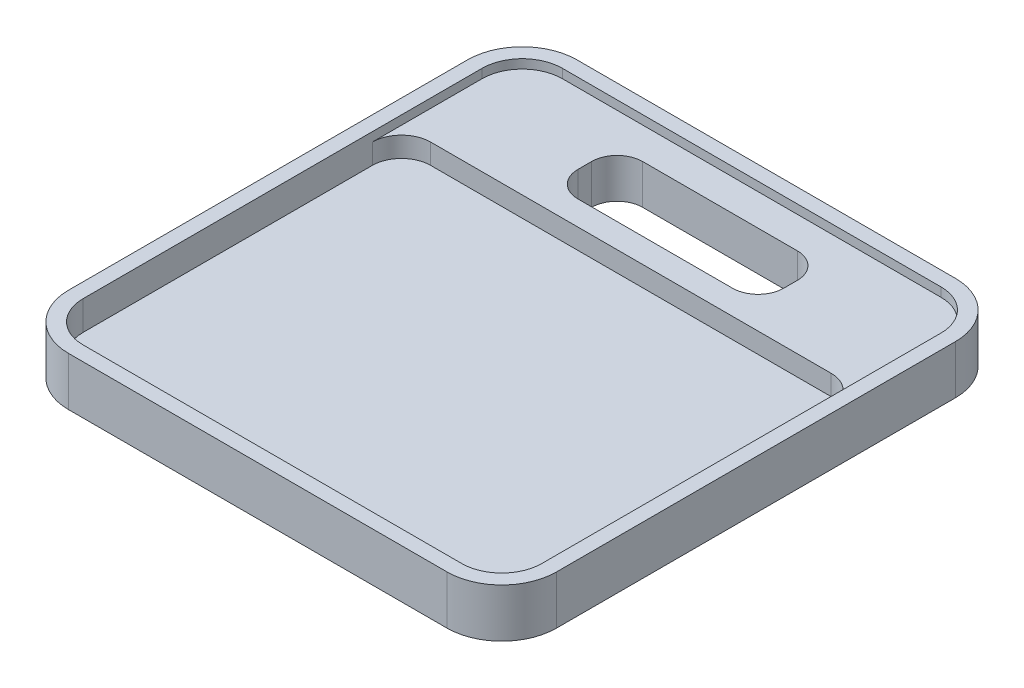
ISO-10303-21;
HEADER;
FILE_DESCRIPTION(('STEP AP214'),'2;1');
FILE_NAME('part.step','',(''),(''),'','','');
FILE_SCHEMA(('AUTOMOTIVE_DESIGN { 1 0 10303 214 1 1 1 1 }'));
ENDSEC;
DATA;
#1=APPLICATION_CONTEXT('core data for automotive mechanical design processes');
#2=APPLICATION_PROTOCOL_DEFINITION('international standard','automotive_design',2000,#1);
#3=PRODUCT_CONTEXT('',#1,'mechanical');
#4=PRODUCT('Part','Part','',(#3));
#5=PRODUCT_RELATED_PRODUCT_CATEGORY('part','',(#4));
#6=PRODUCT_DEFINITION_FORMATION('','',#4);
#7=PRODUCT_DEFINITION_CONTEXT('part definition',#1,'design');
#8=PRODUCT_DEFINITION('design','',#6,#7);
#9=PRODUCT_DEFINITION_SHAPE('','',#8);
#10=(LENGTH_UNIT() NAMED_UNIT(*) SI_UNIT(.MILLI.,.METRE.));
#11=(NAMED_UNIT(*) PLANE_ANGLE_UNIT() SI_UNIT($,.RADIAN.));
#12=(NAMED_UNIT(*) SI_UNIT($,.STERADIAN.) SOLID_ANGLE_UNIT());
#13=UNCERTAINTY_MEASURE_WITH_UNIT(LENGTH_MEASURE(1.E-05),#10,'distance_accuracy_value','');
#14=(GEOMETRIC_REPRESENTATION_CONTEXT(3) GLOBAL_UNCERTAINTY_ASSIGNED_CONTEXT((#13)) GLOBAL_UNIT_ASSIGNED_CONTEXT((#10,
#11,#12)) REPRESENTATION_CONTEXT('',''));
#15=CARTESIAN_POINT('',(0.,0.,0.));
#16=DIRECTION('',(0.,0.,1.));
#17=DIRECTION('',(1.,0.,0.));
#18=AXIS2_PLACEMENT_3D('',#15,#16,#17);
#19=CARTESIAN_POINT('',(9.41759451353933,0.8,-4.88077721223382));
#20=DIRECTION('',(0.,0.,-1.));
#21=DIRECTION('',(-1.,0.,0.));
#22=AXIS2_PLACEMENT_3D('',#19,#20,#21);
#23=PLANE('',#22);
#24=DIRECTION('',(-1.,0.,0.));
#25=VECTOR('',#24,1.);
#26=CARTESIAN_POINT('',(9.41759451353933,0.8,-4.88077721223382));
#27=LINE('',#26,#25);
#28=CARTESIAN_POINT('',(8.21759451353933,0.8,-4.88077721223382));
#29=VERTEX_POINT('',#28);
#30=CARTESIAN_POINT('',(-8.21759451353934,0.8,-4.88077721223382));
#31=VERTEX_POINT('',#30);
#32=EDGE_CURVE('E272',#29,#31,#27,.T.);
#33=ORIENTED_EDGE('',*,*,#32,.F.);
#34=DIRECTION('',(0.,1.,0.));
#35=VECTOR('',#34,1.);
#36=CARTESIAN_POINT('',(8.21759451353933,1.63,-4.88077721223382));
#37=LINE('',#36,#35);
#38=CARTESIAN_POINT('',(8.21759451353933,1.63,-4.88077721223382));
#39=VERTEX_POINT('',#38);
#40=EDGE_CURVE('E426',#29,#39,#37,.T.);
#41=ORIENTED_EDGE('',*,*,#40,.T.);
#42=DIRECTION('',(-1.,0.,0.));
#43=VECTOR('',#42,1.);
#44=CARTESIAN_POINT('',(9.41759451353933,1.63,-4.88077721223382));
#45=LINE('',#44,#43);
#46=CARTESIAN_POINT('',(-8.21759451353934,1.63,-4.88077721223382));
#47=VERTEX_POINT('',#46);
#48=EDGE_CURVE('E234',#39,#47,#45,.T.);
#49=ORIENTED_EDGE('',*,*,#48,.T.);
#50=DIRECTION('',(0.,1.,0.));
#51=VECTOR('',#50,1.);
#52=CARTESIAN_POINT('',(-8.21759451353934,0.8,-4.88077721223382));
#53=LINE('',#52,#51);
#54=EDGE_CURVE('E424',#47,#31,#53,.F.);
#55=ORIENTED_EDGE('',*,*,#54,.T.);
#56=EDGE_LOOP('',(#33,#41,#49,#55));
#57=FACE_BOUND('',#56,.T.);
#58=ADVANCED_FACE('F38',(#57),#23,.F.);
#59=CARTESIAN_POINT('',(-7.77,2.,8.19));
#60=DIRECTION('',(0.,-1.,0.));
#61=DIRECTION('',(0.,0.,-1.));
#62=AXIS2_PLACEMENT_3D('',#59,#60,#61);
#63=CYLINDRICAL_SURFACE('',#62,2.24759451353934);
#64=CARTESIAN_POINT('',(-7.77,0.,8.19));
#65=DIRECTION('',(0.,1.,0.));
#66=DIRECTION('',(0.,0.,1.));
#67=AXIS2_PLACEMENT_3D('',#64,#65,#66);
#68=CIRCLE('',#67,2.24759451353934);
#69=CARTESIAN_POINT('',(-10.0175945135393,0.,8.19));
#70=VERTEX_POINT('',#69);
#71=CARTESIAN_POINT('',(-7.76999999999999,0.,10.4375945135393));
#72=VERTEX_POINT('',#71);
#73=EDGE_CURVE('E344',#70,#72,#68,.T.);
#74=ORIENTED_EDGE('',*,*,#73,.T.);
#75=DIRECTION('',(0.,-1.,0.));
#76=VECTOR('',#75,1.);
#77=CARTESIAN_POINT('',(-7.76999999999999,2.,10.4375945135393));
#78=LINE('',#77,#76);
#79=CARTESIAN_POINT('',(-7.76999999999999,2.,10.4375945135393));
#80=VERTEX_POINT('',#79);
#81=EDGE_CURVE('E421',#80,#72,#78,.T.);
#82=ORIENTED_EDGE('',*,*,#81,.F.);
#83=CARTESIAN_POINT('',(-7.77,2.,8.19));
#84=DIRECTION('',(0.,1.,0.));
#85=DIRECTION('',(0.,0.,1.));
#86=AXIS2_PLACEMENT_3D('',#83,#84,#85);
#87=CIRCLE('',#86,2.24759451353934);
#88=CARTESIAN_POINT('',(-10.0175945135393,2.,8.19));
#89=VERTEX_POINT('',#88);
#90=EDGE_CURVE('E367',#89,#80,#87,.T.);
#91=ORIENTED_EDGE('',*,*,#90,.F.);
#92=DIRECTION('',(0.,-1.,0.));
#93=VECTOR('',#92,1.);
#94=CARTESIAN_POINT('',(-10.0175945135393,2.,8.19));
#95=LINE('',#94,#93);
#96=EDGE_CURVE('E385',#89,#70,#95,.T.);
#97=ORIENTED_EDGE('',*,*,#96,.T.);
#98=EDGE_LOOP('',(#74,#82,#91,#97));
#99=FACE_BOUND('',#98,.T.);
#100=ADVANCED_FACE('F477',(#99),#63,.T.);
#101=CARTESIAN_POINT('',(-7.76999999999999,2.,10.4375945135393));
#102=DIRECTION('',(0.,0.,-1.));
#103=DIRECTION('',(-1.,0.,0.));
#104=AXIS2_PLACEMENT_3D('',#101,#102,#103);
#105=PLANE('',#104);
#106=DIRECTION('',(1.,0.,0.));
#107=VECTOR('',#106,1.);
#108=CARTESIAN_POINT('',(-7.76999999999999,0.,10.4375945135393));
#109=LINE('',#108,#107);
#110=CARTESIAN_POINT('',(7.77,0.,10.4375945135393));
#111=VERTEX_POINT('',#110);
#112=EDGE_CURVE('E388',#72,#111,#109,.T.);
#113=ORIENTED_EDGE('',*,*,#112,.T.);
#114=DIRECTION('',(0.,-1.,0.));
#115=VECTOR('',#114,1.);
#116=CARTESIAN_POINT('',(7.77,2.,10.4375945135393));
#117=LINE('',#116,#115);
#118=CARTESIAN_POINT('',(7.77,2.,10.4375945135393));
#119=VERTEX_POINT('',#118);
#120=EDGE_CURVE('E418',#119,#111,#117,.T.);
#121=ORIENTED_EDGE('',*,*,#120,.F.);
#122=DIRECTION('',(1.,0.,0.));
#123=VECTOR('',#122,1.);
#124=CARTESIAN_POINT('',(-7.76999999999999,2.,10.4375945135393));
#125=LINE('',#124,#123);
#126=EDGE_CURVE('E370',#80,#119,#125,.T.);
#127=ORIENTED_EDGE('',*,*,#126,.F.);
#128=ORIENTED_EDGE('',*,*,#81,.T.);
#129=EDGE_LOOP('',(#113,#121,#127,#128));
#130=FACE_BOUND('',#129,.T.);
#131=ADVANCED_FACE('F482',(#130),#105,.F.);
#132=CARTESIAN_POINT('',(7.77,2.,8.19));
#133=DIRECTION('',(0.,-1.,0.));
#134=DIRECTION('',(0.,0.,-1.));
#135=AXIS2_PLACEMENT_3D('',#132,#133,#134);
#136=CYLINDRICAL_SURFACE('',#135,2.24759451353934);
#137=CARTESIAN_POINT('',(7.77,0.,8.19));
#138=DIRECTION('',(0.,1.,0.));
#139=DIRECTION('',(0.,0.,1.));
#140=AXIS2_PLACEMENT_3D('',#137,#138,#139);
#141=CIRCLE('',#140,2.24759451353934);
#142=CARTESIAN_POINT('',(10.0175945135393,0.,8.19));
#143=VERTEX_POINT('',#142);
#144=EDGE_CURVE('E390',#111,#143,#141,.T.);
#145=ORIENTED_EDGE('',*,*,#144,.T.);
#146=DIRECTION('',(0.,-1.,0.));
#147=VECTOR('',#146,1.);
#148=CARTESIAN_POINT('',(10.0175945135393,2.,8.19));
#149=LINE('',#148,#147);
#150=CARTESIAN_POINT('',(10.0175945135393,2.,8.19));
#151=VERTEX_POINT('',#150);
#152=EDGE_CURVE('E415',#151,#143,#149,.T.);
#153=ORIENTED_EDGE('',*,*,#152,.F.);
#154=CARTESIAN_POINT('',(7.77,2.,8.19));
#155=DIRECTION('',(0.,1.,0.));
#156=DIRECTION('',(0.,0.,1.));
#157=AXIS2_PLACEMENT_3D('',#154,#155,#156);
#158=CIRCLE('',#157,2.24759451353934);
#159=EDGE_CURVE('E373',#119,#151,#158,.T.);
#160=ORIENTED_EDGE('',*,*,#159,.F.);
#161=ORIENTED_EDGE('',*,*,#120,.T.);
#162=EDGE_LOOP('',(#145,#153,#160,#161));
#163=FACE_BOUND('',#162,.T.);
#164=ADVANCED_FACE('F550',(#163),#136,.T.);
#165=CARTESIAN_POINT('',(10.0175945135393,2.,8.19));
#166=DIRECTION('',(-1.,0.,0.));
#167=DIRECTION('',(0.,0.,1.));
#168=AXIS2_PLACEMENT_3D('',#165,#166,#167);
#169=PLANE('',#168);
#170=DIRECTION('',(0.,0.,-1.));
#171=VECTOR('',#170,1.);
#172=CARTESIAN_POINT('',(10.0175945135393,0.,8.19));
#173=LINE('',#172,#171);
#174=CARTESIAN_POINT('',(10.0175945135393,0.,-8.19));
#175=VERTEX_POINT('',#174);
#176=EDGE_CURVE('E392',#143,#175,#173,.T.);
#177=ORIENTED_EDGE('',*,*,#176,.T.);
#178=DIRECTION('',(0.,-1.,0.));
#179=VECTOR('',#178,1.);
#180=CARTESIAN_POINT('',(10.0175945135393,2.,-8.19));
#181=LINE('',#180,#179);
#182=CARTESIAN_POINT('',(10.0175945135393,2.,-8.19));
#183=VERTEX_POINT('',#182);
#184=EDGE_CURVE('E412',#183,#175,#181,.T.);
#185=ORIENTED_EDGE('',*,*,#184,.F.);
#186=DIRECTION('',(0.,0.,-1.));
#187=VECTOR('',#186,1.);
#188=CARTESIAN_POINT('',(10.0175945135393,2.,8.19));
#189=LINE('',#188,#187);
#190=EDGE_CURVE('E375',#151,#183,#189,.T.);
#191=ORIENTED_EDGE('',*,*,#190,.F.);
#192=ORIENTED_EDGE('',*,*,#152,.T.);
#193=EDGE_LOOP('',(#177,#185,#191,#192));
#194=FACE_BOUND('',#193,.T.);
#195=ADVANCED_FACE('F546',(#194),#169,.F.);
#196=CARTESIAN_POINT('',(7.77,2.,-8.19));
#197=DIRECTION('',(0.,-1.,0.));
#198=DIRECTION('',(0.,0.,-1.));
#199=AXIS2_PLACEMENT_3D('',#196,#197,#198);
#200=CYLINDRICAL_SURFACE('',#199,2.24759451353934);
#201=CARTESIAN_POINT('',(7.77,0.,-8.19));
#202=DIRECTION('',(0.,1.,0.));
#203=DIRECTION('',(0.,0.,1.));
#204=AXIS2_PLACEMENT_3D('',#201,#202,#203);
#205=CIRCLE('',#204,2.24759451353934);
#206=CARTESIAN_POINT('',(7.77,0.,-10.4375945135393));
#207=VERTEX_POINT('',#206);
#208=EDGE_CURVE('E394',#175,#207,#205,.T.);
#209=ORIENTED_EDGE('',*,*,#208,.T.);
#210=DIRECTION('',(0.,-1.,0.));
#211=VECTOR('',#210,1.);
#212=CARTESIAN_POINT('',(7.77,2.,-10.4375945135393));
#213=LINE('',#212,#211);
#214=CARTESIAN_POINT('',(7.77,2.,-10.4375945135393));
#215=VERTEX_POINT('',#214);
#216=EDGE_CURVE('E409',#215,#207,#213,.T.);
#217=ORIENTED_EDGE('',*,*,#216,.F.);
#218=CARTESIAN_POINT('',(7.77,2.,-8.19));
#219=DIRECTION('',(0.,1.,0.));
#220=DIRECTION('',(0.,0.,1.));
#221=AXIS2_PLACEMENT_3D('',#218,#219,#220);
#222=CIRCLE('',#221,2.24759451353934);
#223=EDGE_CURVE('E377',#183,#215,#222,.T.);
#224=ORIENTED_EDGE('',*,*,#223,.F.);
#225=ORIENTED_EDGE('',*,*,#184,.T.);
#226=EDGE_LOOP('',(#209,#217,#224,#225));
#227=FACE_BOUND('',#226,.T.);
#228=ADVANCED_FACE('F542',(#227),#200,.T.);
#229=CARTESIAN_POINT('',(7.77,2.,-10.4375945135393));
#230=DIRECTION('',(0.,0.,1.));
#231=DIRECTION('',(1.,0.,0.));
#232=AXIS2_PLACEMENT_3D('',#229,#230,#231);
#233=PLANE('',#232);
#234=DIRECTION('',(-1.,0.,0.));
#235=VECTOR('',#234,1.);
#236=CARTESIAN_POINT('',(7.77,0.,-10.4375945135393));
#237=LINE('',#236,#235);
#238=CARTESIAN_POINT('',(-7.77,0.,-10.4375945135393));
#239=VERTEX_POINT('',#238);
#240=EDGE_CURVE('E396',#207,#239,#237,.T.);
#241=ORIENTED_EDGE('',*,*,#240,.T.);
#242=DIRECTION('',(0.,-1.,0.));
#243=VECTOR('',#242,1.);
#244=CARTESIAN_POINT('',(-7.77,2.,-10.4375945135393));
#245=LINE('',#244,#243);
#246=CARTESIAN_POINT('',(-7.77,2.,-10.4375945135393));
#247=VERTEX_POINT('',#246);
#248=EDGE_CURVE('E406',#247,#239,#245,.T.);
#249=ORIENTED_EDGE('',*,*,#248,.F.);
#250=DIRECTION('',(-1.,0.,0.));
#251=VECTOR('',#250,1.);
#252=CARTESIAN_POINT('',(7.77,2.,-10.4375945135393));
#253=LINE('',#252,#251);
#254=EDGE_CURVE('E379',#215,#247,#253,.T.);
#255=ORIENTED_EDGE('',*,*,#254,.F.);
#256=ORIENTED_EDGE('',*,*,#216,.T.);
#257=EDGE_LOOP('',(#241,#249,#255,#256));
#258=FACE_BOUND('',#257,.T.);
#259=ADVANCED_FACE('F538',(#258),#233,.F.);
#260=CARTESIAN_POINT('',(-7.77,2.,-8.19));
#261=DIRECTION('',(0.,-1.,0.));
#262=DIRECTION('',(0.,0.,-1.));
#263=AXIS2_PLACEMENT_3D('',#260,#261,#262);
#264=CYLINDRICAL_SURFACE('',#263,2.24759451353933);
#265=CARTESIAN_POINT('',(-7.77,0.,-8.19));
#266=DIRECTION('',(0.,1.,0.));
#267=DIRECTION('',(0.,0.,1.));
#268=AXIS2_PLACEMENT_3D('',#265,#266,#267);
#269=CIRCLE('',#268,2.24759451353933);
#270=CARTESIAN_POINT('',(-10.0175945135393,0.,-8.19));
#271=VERTEX_POINT('',#270);
#272=EDGE_CURVE('E398',#239,#271,#269,.T.);
#273=ORIENTED_EDGE('',*,*,#272,.T.);
#274=DIRECTION('',(0.,-1.,0.));
#275=VECTOR('',#274,1.);
#276=CARTESIAN_POINT('',(-10.0175945135393,2.,-8.19));
#277=LINE('',#276,#275);
#278=CARTESIAN_POINT('',(-10.0175945135393,2.,-8.19));
#279=VERTEX_POINT('',#278);
#280=EDGE_CURVE('E403',#279,#271,#277,.T.);
#281=ORIENTED_EDGE('',*,*,#280,.F.);
#282=CARTESIAN_POINT('',(-7.77,2.,-8.19));
#283=DIRECTION('',(0.,1.,0.));
#284=DIRECTION('',(0.,0.,1.));
#285=AXIS2_PLACEMENT_3D('',#282,#283,#284);
#286=CIRCLE('',#285,2.24759451353933);
#287=EDGE_CURVE('E381',#247,#279,#286,.T.);
#288=ORIENTED_EDGE('',*,*,#287,.F.);
#289=ORIENTED_EDGE('',*,*,#248,.T.);
#290=EDGE_LOOP('',(#273,#281,#288,#289));
#291=FACE_BOUND('',#290,.T.);
#292=ADVANCED_FACE('F534',(#291),#264,.T.);
#293=CARTESIAN_POINT('',(-10.0175945135393,2.,-8.19));
#294=DIRECTION('',(1.,0.,0.));
#295=DIRECTION('',(0.,0.,-1.));
#296=AXIS2_PLACEMENT_3D('',#293,#294,#295);
#297=PLANE('',#296);
#298=DIRECTION('',(0.,0.,1.));
#299=VECTOR('',#298,1.);
#300=CARTESIAN_POINT('',(-10.0175945135393,0.,-8.19));
#301=LINE('',#300,#299);
#302=EDGE_CURVE('E371',#271,#70,#301,.T.);
#303=ORIENTED_EDGE('',*,*,#302,.T.);
#304=ORIENTED_EDGE('',*,*,#96,.F.);
#305=DIRECTION('',(0.,0.,1.));
#306=VECTOR('',#305,1.);
#307=CARTESIAN_POINT('',(-10.0175945135393,2.,-8.19));
#308=LINE('',#307,#306);
#309=EDGE_CURVE('E383',#279,#89,#308,.T.);
#310=ORIENTED_EDGE('',*,*,#309,.F.);
#311=ORIENTED_EDGE('',*,*,#280,.T.);
#312=EDGE_LOOP('',(#303,#304,#310,#311));
#313=FACE_BOUND('',#312,.T.);
#314=ADVANCED_FACE('F528',(#313),#297,.F.);
#315=CARTESIAN_POINT('',(-7.77,2.,8.19));
#316=DIRECTION('',(0.,1.,0.));
#317=DIRECTION('',(0.,0.,1.));
#318=AXIS2_PLACEMENT_3D('',#315,#316,#317);
#319=PLANE('',#318);
#320=DIRECTION('',(0.,0.,1.));
#321=VECTOR('',#320,1.);
#322=CARTESIAN_POINT('',(-9.41759451353934,2.,-4.88077721223382));
#323=LINE('',#322,#321);
#324=CARTESIAN_POINT('',(-9.41759451353934,2.,-8.19));
#325=VERTEX_POINT('',#324);
#326=CARTESIAN_POINT('',(-9.41759451353934,2.,8.19));
#327=VERTEX_POINT('',#326);
#328=EDGE_CURVE('E233',#325,#327,#323,.T.);
#329=ORIENTED_EDGE('',*,*,#328,.F.);
#330=CARTESIAN_POINT('',(-7.77,2.,-8.19));
#331=DIRECTION('',(0.,1.,0.));
#332=DIRECTION('',(0.,0.,1.));
#333=AXIS2_PLACEMENT_3D('',#330,#331,#332);
#334=CIRCLE('',#333,1.64759451353933);
#335=CARTESIAN_POINT('',(-7.77,2.,-9.83759451353933));
#336=VERTEX_POINT('',#335);
#337=EDGE_CURVE('E246',#336,#325,#334,.T.);
#338=ORIENTED_EDGE('',*,*,#337,.F.);
#339=DIRECTION('',(-1.,0.,0.));
#340=VECTOR('',#339,1.);
#341=CARTESIAN_POINT('',(7.77,2.,-9.83759451353934));
#342=LINE('',#341,#340);
#343=CARTESIAN_POINT('',(7.77,2.,-9.83759451353934));
#344=VERTEX_POINT('',#343);
#345=EDGE_CURVE('E252',#344,#336,#342,.T.);
#346=ORIENTED_EDGE('',*,*,#345,.F.);
#347=CARTESIAN_POINT('',(7.77,2.,-8.19));
#348=DIRECTION('',(0.,1.,0.));
#349=DIRECTION('',(0.,0.,1.));
#350=AXIS2_PLACEMENT_3D('',#347,#348,#349);
#351=CIRCLE('',#350,1.64759451353934);
#352=CARTESIAN_POINT('',(9.41759451353933,2.,-8.19));
#353=VERTEX_POINT('',#352);
#354=EDGE_CURVE('E240',#353,#344,#351,.T.);
#355=ORIENTED_EDGE('',*,*,#354,.F.);
#356=DIRECTION('',(0.,0.,-1.));
#357=VECTOR('',#356,1.);
#358=CARTESIAN_POINT('',(9.41759451353933,2.,8.19));
#359=LINE('',#358,#357);
#360=CARTESIAN_POINT('',(9.41759451353933,2.,8.19));
#361=VERTEX_POINT('',#360);
#362=EDGE_CURVE('E223',#361,#353,#359,.T.);
#363=ORIENTED_EDGE('',*,*,#362,.F.);
#364=CARTESIAN_POINT('',(7.77,2.,8.19));
#365=DIRECTION('',(0.,1.,0.));
#366=DIRECTION('',(0.,0.,1.));
#367=AXIS2_PLACEMENT_3D('',#364,#365,#366);
#368=CIRCLE('',#367,1.64759451353934);
#369=CARTESIAN_POINT('',(7.77,2.,9.83759451353934));
#370=VERTEX_POINT('',#369);
#371=EDGE_CURVE('E273',#370,#361,#368,.T.);
#372=ORIENTED_EDGE('',*,*,#371,.F.);
#373=DIRECTION('',(1.,0.,0.));
#374=VECTOR('',#373,1.);
#375=CARTESIAN_POINT('',(-7.77,2.,9.83759451353933));
#376=LINE('',#375,#374);
#377=CARTESIAN_POINT('',(-7.77,2.,9.83759451353933));
#378=VERTEX_POINT('',#377);
#379=EDGE_CURVE('E292',#378,#370,#376,.T.);
#380=ORIENTED_EDGE('',*,*,#379,.F.);
#381=CARTESIAN_POINT('',(-7.77,2.,8.19));
#382=DIRECTION('',(0.,1.,0.));
#383=DIRECTION('',(0.,0.,1.));
#384=AXIS2_PLACEMENT_3D('',#381,#382,#383);
#385=CIRCLE('',#384,1.64759451353934);
#386=EDGE_CURVE('E289',#327,#378,#385,.T.);
#387=ORIENTED_EDGE('',*,*,#386,.F.);
#388=EDGE_LOOP('',(#329,#338,#346,#355,#363,#372,#380,#387));
#389=FACE_BOUND('',#388,.T.);
#390=ORIENTED_EDGE('',*,*,#90,.T.);
#391=ORIENTED_EDGE('',*,*,#126,.T.);
#392=ORIENTED_EDGE('',*,*,#159,.T.);
#393=ORIENTED_EDGE('',*,*,#190,.T.);
#394=ORIENTED_EDGE('',*,*,#223,.T.);
#395=ORIENTED_EDGE('',*,*,#254,.T.);
#396=ORIENTED_EDGE('',*,*,#287,.T.);
#397=ORIENTED_EDGE('',*,*,#309,.T.);
#398=EDGE_LOOP('',(#390,#391,#392,#393,#394,#395,#396,#397));
#399=FACE_BOUND('',#398,.T.);
#400=ADVANCED_FACE('F248',(#389,#399),#319,.T.);
#401=CARTESIAN_POINT('',(-7.77,0.,8.19));
#402=DIRECTION('',(0.,1.,0.));
#403=DIRECTION('',(0.,0.,1.));
#404=AXIS2_PLACEMENT_3D('',#401,#402,#403);
#405=PLANE('',#404);
#406=ORIENTED_EDGE('',*,*,#73,.F.);
#407=ORIENTED_EDGE('',*,*,#302,.F.);
#408=ORIENTED_EDGE('',*,*,#272,.F.);
#409=ORIENTED_EDGE('',*,*,#240,.F.);
#410=ORIENTED_EDGE('',*,*,#208,.F.);
#411=ORIENTED_EDGE('',*,*,#176,.F.);
#412=ORIENTED_EDGE('',*,*,#144,.F.);
#413=ORIENTED_EDGE('',*,*,#112,.F.);
#414=EDGE_LOOP('',(#406,#407,#408,#409,#410,#411,#412,#413));
#415=FACE_BOUND('',#414,.T.);
#416=CARTESIAN_POINT('',(-3.17499999999488,0.,-7.49077721226704));
#417=DIRECTION('',(0.,-1.,0.));
#418=DIRECTION('',(0.,0.,-1.));
#419=AXIS2_PLACEMENT_3D('',#416,#417,#418);
#420=CIRCLE('',#419,1.05);
#421=CARTESIAN_POINT('',(-4.22499999999488,0.,-7.49077721226704));
#422=VERTEX_POINT('',#421);
#423=CARTESIAN_POINT('',(-3.17499999999488,0.,-8.54077721226704));
#424=VERTEX_POINT('',#423);
#425=EDGE_CURVE('E332',#422,#424,#420,.T.);
#426=ORIENTED_EDGE('',*,*,#425,.F.);
#427=DIRECTION('',(0.,0.,-1.));
#428=VECTOR('',#427,1.);
#429=CARTESIAN_POINT('',(-4.22499999999488,0.,-7.49077721226704));
#430=LINE('',#429,#428);
#431=CARTESIAN_POINT('',(-4.22499999999488,0.,-6.93077721223382));
#432=VERTEX_POINT('',#431);
#433=EDGE_CURVE('E303',#432,#422,#430,.T.);
#434=ORIENTED_EDGE('',*,*,#433,.F.);
#435=CARTESIAN_POINT('',(-3.17499999999488,0.,-6.93077721223382));
#436=DIRECTION('',(0.,-1.,0.));
#437=DIRECTION('',(0.,0.,-1.));
#438=AXIS2_PLACEMENT_3D('',#435,#436,#437);
#439=CIRCLE('',#438,1.05);
#440=CARTESIAN_POINT('',(-3.17499999999488,0.,-5.88077721223382));
#441=VERTEX_POINT('',#440);
#442=EDGE_CURVE('E308',#441,#432,#439,.T.);
#443=ORIENTED_EDGE('',*,*,#442,.F.);
#444=DIRECTION('',(-1.,0.,0.));
#445=VECTOR('',#444,1.);
#446=CARTESIAN_POINT('',(-3.17499999999488,0.,-5.88077721223382));
#447=LINE('',#446,#445);
#448=CARTESIAN_POINT('',(3.17499999999488,0.,-5.88077721223382));
#449=VERTEX_POINT('',#448);
#450=EDGE_CURVE('E312',#449,#441,#447,.T.);
#451=ORIENTED_EDGE('',*,*,#450,.F.);
#452=CARTESIAN_POINT('',(3.17499999999488,0.,-6.93077721223382));
#453=DIRECTION('',(0.,-1.,0.));
#454=DIRECTION('',(0.,0.,-1.));
#455=AXIS2_PLACEMENT_3D('',#452,#453,#454);
#456=CIRCLE('',#455,1.05);
#457=CARTESIAN_POINT('',(4.22499999999488,0.,-6.93077721223382));
#458=VERTEX_POINT('',#457);
#459=EDGE_CURVE('E316',#458,#449,#456,.T.);
#460=ORIENTED_EDGE('',*,*,#459,.F.);
#461=DIRECTION('',(0.,0.,1.));
#462=VECTOR('',#461,1.);
#463=CARTESIAN_POINT('',(4.22499999999488,0.,-6.93077721223382));
#464=LINE('',#463,#462);
#465=CARTESIAN_POINT('',(4.22499999999488,0.,-7.49077721226704));
#466=VERTEX_POINT('',#465);
#467=EDGE_CURVE('E320',#466,#458,#464,.T.);
#468=ORIENTED_EDGE('',*,*,#467,.F.);
#469=CARTESIAN_POINT('',(3.17499999999488,0.,-7.49077721226704));
#470=DIRECTION('',(0.,-1.,0.));
#471=DIRECTION('',(0.,0.,-1.));
#472=AXIS2_PLACEMENT_3D('',#469,#470,#471);
#473=CIRCLE('',#472,1.05);
#474=CARTESIAN_POINT('',(3.17499999999488,0.,-8.54077721226704));
#475=VERTEX_POINT('',#474);
#476=EDGE_CURVE('E324',#475,#466,#473,.T.);
#477=ORIENTED_EDGE('',*,*,#476,.F.);
#478=DIRECTION('',(1.,0.,0.));
#479=VECTOR('',#478,1.);
#480=CARTESIAN_POINT('',(3.17499999999488,0.,-8.54077721226704));
#481=LINE('',#480,#479);
#482=EDGE_CURVE('E328',#424,#475,#481,.T.);
#483=ORIENTED_EDGE('',*,*,#482,.F.);
#484=EDGE_LOOP('',(#426,#434,#443,#451,#460,#468,#477,#483));
#485=FACE_BOUND('',#484,.T.);
#486=ADVANCED_FACE('F521',(#415,#485),#405,.F.);
#487=CARTESIAN_POINT('',(-3.17499999999488,11.6059353987377,-7.49077721226704));
#488=DIRECTION('',(0.,-1.,0.));
#489=DIRECTION('',(0.,0.,-1.));
#490=AXIS2_PLACEMENT_3D('',#487,#488,#489);
#491=CYLINDRICAL_SURFACE('',#490,1.05);
#492=CARTESIAN_POINT('',(-3.17499999999488,1.63,-7.49077721226704));
#493=DIRECTION('',(0.,1.,0.));
#494=DIRECTION('',(-1.,0.,0.));
#495=AXIS2_PLACEMENT_3D('',#492,#493,#494);
#496=CIRCLE('',#495,1.05);
#497=CARTESIAN_POINT('',(-4.22499999999488,1.63,-7.49077721226704));
#498=VERTEX_POINT('',#497);
#499=CARTESIAN_POINT('',(-3.17499999999488,1.63,-8.54077721226704));
#500=VERTEX_POINT('',#499);
#501=EDGE_CURVE('E335',#498,#500,#496,.F.);
#502=ORIENTED_EDGE('',*,*,#501,.F.);
#503=DIRECTION('',(0.,-1.,0.));
#504=VECTOR('',#503,1.);
#505=CARTESIAN_POINT('',(-4.22499999999488,11.6059353987377,-7.49077721226704));
#506=LINE('',#505,#504);
#507=EDGE_CURVE('E297',#498,#422,#506,.T.);
#508=ORIENTED_EDGE('',*,*,#507,.T.);
#509=ORIENTED_EDGE('',*,*,#425,.T.);
#510=DIRECTION('',(0.,-1.,0.));
#511=VECTOR('',#510,1.);
#512=CARTESIAN_POINT('',(-3.17499999999488,11.6059353987377,-8.54077721226704));
#513=LINE('',#512,#511);
#514=EDGE_CURVE('E327',#500,#424,#513,.T.);
#515=ORIENTED_EDGE('',*,*,#514,.F.);
#516=EDGE_LOOP('',(#502,#508,#509,#515));
#517=FACE_BOUND('',#516,.T.);
#518=ADVANCED_FACE('F517',(#517),#491,.F.);
#519=CARTESIAN_POINT('',(-4.22499999999488,11.6059353987377,-7.49077721226704));
#520=DIRECTION('',(-1.,0.,0.));
#521=DIRECTION('',(0.,0.,1.));
#522=AXIS2_PLACEMENT_3D('',#519,#520,#521);
#523=PLANE('',#522);
#524=DIRECTION('',(0.,0.,-1.));
#525=VECTOR('',#524,1.);
#526=CARTESIAN_POINT('',(-4.22499999999488,1.63,-7.49077721226704));
#527=LINE('',#526,#525);
#528=CARTESIAN_POINT('',(-4.22499999999488,1.63,-6.93077721223382));
#529=VERTEX_POINT('',#528);
#530=EDGE_CURVE('E331',#529,#498,#527,.T.);
#531=ORIENTED_EDGE('',*,*,#530,.F.);
#532=DIRECTION('',(0.,-1.,0.));
#533=VECTOR('',#532,1.);
#534=CARTESIAN_POINT('',(-4.22499999999488,11.6059353987377,-6.93077721223382));
#535=LINE('',#534,#533);
#536=EDGE_CURVE('E307',#529,#432,#535,.T.);
#537=ORIENTED_EDGE('',*,*,#536,.T.);
#538=ORIENTED_EDGE('',*,*,#433,.T.);
#539=ORIENTED_EDGE('',*,*,#507,.F.);
#540=EDGE_LOOP('',(#531,#537,#538,#539));
#541=FACE_BOUND('',#540,.T.);
#542=ADVANCED_FACE('F513',(#541),#523,.F.);
#543=CARTESIAN_POINT('',(-3.17499999999488,11.6059353987377,-6.93077721223382));
#544=DIRECTION('',(0.,-1.,0.));
#545=DIRECTION('',(0.,0.,-1.));
#546=AXIS2_PLACEMENT_3D('',#543,#544,#545);
#547=CYLINDRICAL_SURFACE('',#546,1.05);
#548=CARTESIAN_POINT('',(-3.17499999999488,1.63,-6.93077721223382));
#549=DIRECTION('',(0.,1.,0.));
#550=DIRECTION('',(-1.,0.,0.));
#551=AXIS2_PLACEMENT_3D('',#548,#549,#550);
#552=CIRCLE('',#551,1.05);
#553=CARTESIAN_POINT('',(-3.17499999999488,1.63,-5.88077721223382));
#554=VERTEX_POINT('',#553);
#555=EDGE_CURVE('E341',#554,#529,#552,.F.);
#556=ORIENTED_EDGE('',*,*,#555,.F.);
#557=DIRECTION('',(0.,-1.,0.));
#558=VECTOR('',#557,1.);
#559=CARTESIAN_POINT('',(-3.17499999999488,11.6059353987377,-5.88077721223382));
#560=LINE('',#559,#558);
#561=EDGE_CURVE('E306',#554,#441,#560,.T.);
#562=ORIENTED_EDGE('',*,*,#561,.T.);
#563=ORIENTED_EDGE('',*,*,#442,.T.);
#564=ORIENTED_EDGE('',*,*,#536,.F.);
#565=EDGE_LOOP('',(#556,#562,#563,#564));
#566=FACE_BOUND('',#565,.T.);
#567=ADVANCED_FACE('F509',(#566),#547,.F.);
#568=CARTESIAN_POINT('',(-3.17499999999488,11.6059353987377,-5.88077721223382));
#569=DIRECTION('',(0.,0.,1.));
#570=DIRECTION('',(1.,0.,0.));
#571=AXIS2_PLACEMENT_3D('',#568,#569,#570);
#572=PLANE('',#571);
#573=DIRECTION('',(-1.,0.,0.));
#574=VECTOR('',#573,1.);
#575=CARTESIAN_POINT('',(-3.17499999999488,1.63,-5.88077721223382));
#576=LINE('',#575,#574);
#577=CARTESIAN_POINT('',(3.17499999999488,1.63,-5.88077721223382));
#578=VERTEX_POINT('',#577);
#579=EDGE_CURVE('E345',#578,#554,#576,.T.);
#580=ORIENTED_EDGE('',*,*,#579,.F.);
#581=DIRECTION('',(0.,-1.,0.));
#582=VECTOR('',#581,1.);
#583=CARTESIAN_POINT('',(3.17499999999488,11.6059353987377,-5.88077721223382));
#584=LINE('',#583,#582);
#585=EDGE_CURVE('E311',#578,#449,#584,.T.);
#586=ORIENTED_EDGE('',*,*,#585,.T.);
#587=ORIENTED_EDGE('',*,*,#450,.T.);
#588=ORIENTED_EDGE('',*,*,#561,.F.);
#589=EDGE_LOOP('',(#580,#586,#587,#588));
#590=FACE_BOUND('',#589,.T.);
#591=ADVANCED_FACE('F505',(#590),#572,.F.);
#592=CARTESIAN_POINT('',(3.17499999999488,11.6059353987377,-6.93077721223382));
#593=DIRECTION('',(0.,-1.,0.));
#594=DIRECTION('',(0.,0.,-1.));
#595=AXIS2_PLACEMENT_3D('',#592,#593,#594);
#596=CYLINDRICAL_SURFACE('',#595,1.05);
#597=CARTESIAN_POINT('',(3.17499999999488,1.63,-6.93077721223382));
#598=DIRECTION('',(0.,1.,0.));
#599=DIRECTION('',(-1.,0.,0.));
#600=AXIS2_PLACEMENT_3D('',#597,#598,#599);
#601=CIRCLE('',#600,1.05);
#602=CARTESIAN_POINT('',(4.22499999999488,1.63,-6.93077721223382));
#603=VERTEX_POINT('',#602);
#604=EDGE_CURVE('E348',#603,#578,#601,.F.);
#605=ORIENTED_EDGE('',*,*,#604,.F.);
#606=DIRECTION('',(0.,-1.,0.));
#607=VECTOR('',#606,1.);
#608=CARTESIAN_POINT('',(4.22499999999488,11.6059353987377,-6.93077721223382));
#609=LINE('',#608,#607);
#610=EDGE_CURVE('E315',#603,#458,#609,.T.);
#611=ORIENTED_EDGE('',*,*,#610,.T.);
#612=ORIENTED_EDGE('',*,*,#459,.T.);
#613=ORIENTED_EDGE('',*,*,#585,.F.);
#614=EDGE_LOOP('',(#605,#611,#612,#613));
#615=FACE_BOUND('',#614,.T.);
#616=ADVANCED_FACE('F501',(#615),#596,.F.);
#617=CARTESIAN_POINT('',(4.22499999999488,11.6059353987377,-6.93077721223382));
#618=DIRECTION('',(1.,0.,0.));
#619=DIRECTION('',(0.,0.,-1.));
#620=AXIS2_PLACEMENT_3D('',#617,#618,#619);
#621=PLANE('',#620);
#622=DIRECTION('',(0.,0.,1.));
#623=VECTOR('',#622,1.);
#624=CARTESIAN_POINT('',(4.22499999999488,1.63,-6.93077721223382));
#625=LINE('',#624,#623);
#626=CARTESIAN_POINT('',(4.22499999999488,1.63,-7.49077721226704));
#627=VERTEX_POINT('',#626);
#628=EDGE_CURVE('E351',#627,#603,#625,.T.);
#629=ORIENTED_EDGE('',*,*,#628,.F.);
#630=DIRECTION('',(0.,-1.,0.));
#631=VECTOR('',#630,1.);
#632=CARTESIAN_POINT('',(4.22499999999488,11.6059353987377,-7.49077721226704));
#633=LINE('',#632,#631);
#634=EDGE_CURVE('E319',#627,#466,#633,.T.);
#635=ORIENTED_EDGE('',*,*,#634,.T.);
#636=ORIENTED_EDGE('',*,*,#467,.T.);
#637=ORIENTED_EDGE('',*,*,#610,.F.);
#638=EDGE_LOOP('',(#629,#635,#636,#637));
#639=FACE_BOUND('',#638,.T.);
#640=ADVANCED_FACE('F497',(#639),#621,.F.);
#641=CARTESIAN_POINT('',(3.17499999999488,11.6059353987377,-7.49077721226704));
#642=DIRECTION('',(0.,-1.,0.));
#643=DIRECTION('',(0.,0.,-1.));
#644=AXIS2_PLACEMENT_3D('',#641,#642,#643);
#645=CYLINDRICAL_SURFACE('',#644,1.05);
#646=CARTESIAN_POINT('',(3.17499999999488,1.63,-7.49077721226704));
#647=DIRECTION('',(0.,1.,0.));
#648=DIRECTION('',(-1.,0.,0.));
#649=AXIS2_PLACEMENT_3D('',#646,#647,#648);
#650=CIRCLE('',#649,1.05);
#651=CARTESIAN_POINT('',(3.17499999999488,1.63,-8.54077721226704));
#652=VERTEX_POINT('',#651);
#653=EDGE_CURVE('E354',#652,#627,#650,.F.);
#654=ORIENTED_EDGE('',*,*,#653,.F.);
#655=DIRECTION('',(0.,-1.,0.));
#656=VECTOR('',#655,1.);
#657=CARTESIAN_POINT('',(3.17499999999488,11.6059353987377,-8.54077721226704));
#658=LINE('',#657,#656);
#659=EDGE_CURVE('E323',#652,#475,#658,.T.);
#660=ORIENTED_EDGE('',*,*,#659,.T.);
#661=ORIENTED_EDGE('',*,*,#476,.T.);
#662=ORIENTED_EDGE('',*,*,#634,.F.);
#663=EDGE_LOOP('',(#654,#660,#661,#662));
#664=FACE_BOUND('',#663,.T.);
#665=ADVANCED_FACE('F493',(#664),#645,.F.);
#666=CARTESIAN_POINT('',(3.17499999999488,11.6059353987377,-8.54077721226704));
#667=DIRECTION('',(0.,0.,-1.));
#668=DIRECTION('',(-1.,0.,0.));
#669=AXIS2_PLACEMENT_3D('',#666,#667,#668);
#670=PLANE('',#669);
#671=DIRECTION('',(1.,0.,0.));
#672=VECTOR('',#671,1.);
#673=CARTESIAN_POINT('',(3.17499999999488,1.63,-8.54077721226704));
#674=LINE('',#673,#672);
#675=EDGE_CURVE('E338',#500,#652,#674,.T.);
#676=ORIENTED_EDGE('',*,*,#675,.F.);
#677=ORIENTED_EDGE('',*,*,#514,.T.);
#678=ORIENTED_EDGE('',*,*,#482,.T.);
#679=ORIENTED_EDGE('',*,*,#659,.F.);
#680=EDGE_LOOP('',(#676,#677,#678,#679));
#681=FACE_BOUND('',#680,.T.);
#682=ADVANCED_FACE('F490',(#681),#670,.F.);
#683=CARTESIAN_POINT('',(-3.17500000000512,1.63,-7.49077721226704));
#684=DIRECTION('',(0.,1.,0.));
#685=DIRECTION('',(0.,0.,-1.));
#686=AXIS2_PLACEMENT_3D('',#683,#684,#685);
#687=PLANE('',#686);
#688=ORIENTED_EDGE('',*,*,#530,.T.);
#689=ORIENTED_EDGE('',*,*,#501,.T.);
#690=ORIENTED_EDGE('',*,*,#675,.T.);
#691=ORIENTED_EDGE('',*,*,#653,.T.);
#692=ORIENTED_EDGE('',*,*,#628,.T.);
#693=ORIENTED_EDGE('',*,*,#604,.T.);
#694=ORIENTED_EDGE('',*,*,#579,.T.);
#695=ORIENTED_EDGE('',*,*,#555,.T.);
#696=EDGE_LOOP('',(#688,#689,#690,#691,#692,#693,#694,#695));
#697=FACE_BOUND('',#696,.T.);
#698=DIRECTION('',(0.,0.,-1.));
#699=VECTOR('',#698,1.);
#700=CARTESIAN_POINT('',(-9.41759451353934,1.63,-4.88077721223382));
#701=LINE('',#700,#699);
#702=CARTESIAN_POINT('',(-9.41759451353934,1.63,-3.68077721223382));
#703=VERTEX_POINT('',#702);
#704=CARTESIAN_POINT('',(-9.41759451353934,1.63,-8.19));
#705=VERTEX_POINT('',#704);
#706=EDGE_CURVE('E52',#703,#705,#701,.T.);
#707=ORIENTED_EDGE('',*,*,#706,.F.);
#708=CARTESIAN_POINT('',(-8.21759451353934,1.63,-3.68077721223382));
#709=DIRECTION('',(0.,1.,0.));
#710=DIRECTION('',(-1.,0.,0.));
#711=AXIS2_PLACEMENT_3D('',#708,#709,#710);
#712=CIRCLE('',#711,1.2);
#713=EDGE_CURVE('E12',#703,#47,#712,.F.);
#714=ORIENTED_EDGE('',*,*,#713,.T.);
#715=ORIENTED_EDGE('',*,*,#48,.F.);
#716=CARTESIAN_POINT('',(8.21759451353933,1.63,-3.68077721223382));
#717=DIRECTION('',(0.,1.,0.));
#718=DIRECTION('',(-1.,0.,0.));
#719=AXIS2_PLACEMENT_3D('',#716,#717,#718);
#720=CIRCLE('',#719,1.2);
#721=CARTESIAN_POINT('',(9.41759451353933,1.63,-3.68077721223382));
#722=VERTEX_POINT('',#721);
#723=EDGE_CURVE('E46',#39,#722,#720,.F.);
#724=ORIENTED_EDGE('',*,*,#723,.T.);
#725=DIRECTION('',(0.,0.,1.));
#726=VECTOR('',#725,1.);
#727=CARTESIAN_POINT('',(9.41759451353933,1.63,-8.19));
#728=LINE('',#727,#726);
#729=CARTESIAN_POINT('',(9.41759451353933,1.63,-8.19));
#730=VERTEX_POINT('',#729);
#731=EDGE_CURVE('E263',#730,#722,#728,.T.);
#732=ORIENTED_EDGE('',*,*,#731,.F.);
#733=CARTESIAN_POINT('',(7.77,1.63,-8.19));
#734=DIRECTION('',(0.,1.,0.));
#735=DIRECTION('',(-1.,0.,0.));
#736=AXIS2_PLACEMENT_3D('',#733,#734,#735);
#737=CIRCLE('',#736,1.64759451353934);
#738=CARTESIAN_POINT('',(7.77,1.63,-9.83759451353934));
#739=VERTEX_POINT('',#738);
#740=EDGE_CURVE('E243',#739,#730,#737,.F.);
#741=ORIENTED_EDGE('',*,*,#740,.F.);
#742=DIRECTION('',(1.,0.,0.));
#743=VECTOR('',#742,1.);
#744=CARTESIAN_POINT('',(7.77,1.63,-9.83759451353934));
#745=LINE('',#744,#743);
#746=CARTESIAN_POINT('',(-7.77,1.63,-9.83759451353933));
#747=VERTEX_POINT('',#746);
#748=EDGE_CURVE('E468',#747,#739,#745,.T.);
#749=ORIENTED_EDGE('',*,*,#748,.F.);
#750=CARTESIAN_POINT('',(-7.77,1.63,-8.19));
#751=DIRECTION('',(0.,1.,0.));
#752=DIRECTION('',(-1.,0.,0.));
#753=AXIS2_PLACEMENT_3D('',#750,#751,#752);
#754=CIRCLE('',#753,1.64759451353933);
#755=EDGE_CURVE('E464',#705,#747,#754,.F.);
#756=ORIENTED_EDGE('',*,*,#755,.F.);
#757=EDGE_LOOP('',(#707,#714,#715,#724,#732,#741,#749,#756));
#758=FACE_BOUND('',#757,.T.);
#759=ADVANCED_FACE('F439',(#697,#758),#687,.T.);
#760=CARTESIAN_POINT('',(9.41759451353933,0.8,8.19));
#761=DIRECTION('',(1.,0.,0.));
#762=DIRECTION('',(0.,0.,-1.));
#763=AXIS2_PLACEMENT_3D('',#760,#761,#762);
#764=PLANE('',#763);
#765=ORIENTED_EDGE('',*,*,#731,.T.);
#766=DIRECTION('',(0.,1.,0.));
#767=VECTOR('',#766,1.);
#768=CARTESIAN_POINT('',(9.41759451353933,0.8,-3.68077721223382));
#769=LINE('',#768,#767);
#770=CARTESIAN_POINT('',(9.41759451353933,0.8,-3.68077721223382));
#771=VERTEX_POINT('',#770);
#772=EDGE_CURVE('E429',#722,#771,#769,.F.);
#773=ORIENTED_EDGE('',*,*,#772,.T.);
#774=DIRECTION('',(0.,0.,-1.));
#775=VECTOR('',#774,1.);
#776=CARTESIAN_POINT('',(9.41759451353933,0.8,8.19));
#777=LINE('',#776,#775);
#778=CARTESIAN_POINT('',(9.41759451353933,0.8,8.19));
#779=VERTEX_POINT('',#778);
#780=EDGE_CURVE('E269',#779,#771,#777,.T.);
#781=ORIENTED_EDGE('',*,*,#780,.F.);
#782=DIRECTION('',(0.,1.,0.));
#783=VECTOR('',#782,1.);
#784=CARTESIAN_POINT('',(9.41759451353933,0.8,8.19));
#785=LINE('',#784,#783);
#786=EDGE_CURVE('E228',#779,#361,#785,.T.);
#787=ORIENTED_EDGE('',*,*,#786,.T.);
#788=ORIENTED_EDGE('',*,*,#362,.T.);
#789=DIRECTION('',(0.,1.,0.));
#790=VECTOR('',#789,1.);
#791=CARTESIAN_POINT('',(9.41759451353933,-17.8465085024063,-8.19));
#792=LINE('',#791,#790);
#793=EDGE_CURVE('E226',#730,#353,#792,.T.);
#794=ORIENTED_EDGE('',*,*,#793,.F.);
#795=EDGE_LOOP('',(#765,#773,#781,#787,#788,#794));
#796=FACE_BOUND('',#795,.T.);
#797=ADVANCED_FACE('F225',(#796),#764,.F.);
#798=CARTESIAN_POINT('',(7.77,0.8,8.19));
#799=DIRECTION('',(0.,1.,0.));
#800=DIRECTION('',(0.,0.,1.));
#801=AXIS2_PLACEMENT_3D('',#798,#799,#800);
#802=CYLINDRICAL_SURFACE('',#801,1.64759451353934);
#803=ORIENTED_EDGE('',*,*,#371,.T.);
#804=ORIENTED_EDGE('',*,*,#786,.F.);
#805=CARTESIAN_POINT('',(7.77,0.8,8.19));
#806=DIRECTION('',(0.,1.,0.));
#807=DIRECTION('',(0.,0.,1.));
#808=AXIS2_PLACEMENT_3D('',#805,#806,#807);
#809=CIRCLE('',#808,1.64759451353934);
#810=CARTESIAN_POINT('',(7.77,0.8,9.83759451353934));
#811=VERTEX_POINT('',#810);
#812=EDGE_CURVE('E283',#811,#779,#809,.T.);
#813=ORIENTED_EDGE('',*,*,#812,.F.);
#814=DIRECTION('',(0.,1.,0.));
#815=VECTOR('',#814,1.);
#816=CARTESIAN_POINT('',(7.77,0.8,9.83759451353934));
#817=LINE('',#816,#815);
#818=EDGE_CURVE('E298',#811,#370,#817,.T.);
#819=ORIENTED_EDGE('',*,*,#818,.T.);
#820=EDGE_LOOP('',(#803,#804,#813,#819));
#821=FACE_BOUND('',#820,.T.);
#822=ADVANCED_FACE('F449',(#821),#802,.F.);
#823=CARTESIAN_POINT('',(-7.77,0.8,9.83759451353933));
#824=DIRECTION('',(0.,0.,1.));
#825=DIRECTION('',(1.,0.,0.));
#826=AXIS2_PLACEMENT_3D('',#823,#824,#825);
#827=PLANE('',#826);
#828=ORIENTED_EDGE('',*,*,#379,.T.);
#829=ORIENTED_EDGE('',*,*,#818,.F.);
#830=DIRECTION('',(1.,0.,0.));
#831=VECTOR('',#830,1.);
#832=CARTESIAN_POINT('',(-7.77,0.8,9.83759451353933));
#833=LINE('',#832,#831);
#834=CARTESIAN_POINT('',(-7.77,0.8,9.83759451353933));
#835=VERTEX_POINT('',#834);
#836=EDGE_CURVE('E280',#835,#811,#833,.T.);
#837=ORIENTED_EDGE('',*,*,#836,.F.);
#838=DIRECTION('',(0.,1.,0.));
#839=VECTOR('',#838,1.);
#840=CARTESIAN_POINT('',(-7.77,0.8,9.83759451353933));
#841=LINE('',#840,#839);
#842=EDGE_CURVE('E300',#835,#378,#841,.T.);
#843=ORIENTED_EDGE('',*,*,#842,.T.);
#844=EDGE_LOOP('',(#828,#829,#837,#843));
#845=FACE_BOUND('',#844,.T.);
#846=ADVANCED_FACE('F453',(#845),#827,.F.);
#847=CARTESIAN_POINT('',(-7.77,0.8,8.19));
#848=DIRECTION('',(0.,1.,0.));
#849=DIRECTION('',(0.,0.,1.));
#850=AXIS2_PLACEMENT_3D('',#847,#848,#849);
#851=CYLINDRICAL_SURFACE('',#850,1.64759451353934);
#852=ORIENTED_EDGE('',*,*,#386,.T.);
#853=ORIENTED_EDGE('',*,*,#842,.F.);
#854=CARTESIAN_POINT('',(-7.77,0.8,8.19));
#855=DIRECTION('',(0.,1.,0.));
#856=DIRECTION('',(0.,0.,1.));
#857=AXIS2_PLACEMENT_3D('',#854,#855,#856);
#858=CIRCLE('',#857,1.64759451353934);
#859=CARTESIAN_POINT('',(-9.41759451353934,0.8,8.19));
#860=VERTEX_POINT('',#859);
#861=EDGE_CURVE('E277',#860,#835,#858,.T.);
#862=ORIENTED_EDGE('',*,*,#861,.F.);
#863=DIRECTION('',(0.,1.,0.));
#864=VECTOR('',#863,1.);
#865=CARTESIAN_POINT('',(-9.41759451353934,0.8,8.19));
#866=LINE('',#865,#864);
#867=EDGE_CURVE('E285',#860,#327,#866,.T.);
#868=ORIENTED_EDGE('',*,*,#867,.T.);
#869=EDGE_LOOP('',(#852,#853,#862,#868));
#870=FACE_BOUND('',#869,.T.);
#871=ADVANCED_FACE('F456',(#870),#851,.F.);
#872=CARTESIAN_POINT('',(-9.41759451353934,0.8,-4.88077721223382));
#873=DIRECTION('',(-1.,0.,0.));
#874=DIRECTION('',(0.,0.,1.));
#875=AXIS2_PLACEMENT_3D('',#872,#873,#874);
#876=PLANE('',#875);
#877=DIRECTION('',(0.,0.,1.));
#878=VECTOR('',#877,1.);
#879=CARTESIAN_POINT('',(-9.41759451353934,0.8,-4.88077721223382));
#880=LINE('',#879,#878);
#881=CARTESIAN_POINT('',(-9.41759451353934,0.8,-3.68077721223382));
#882=VERTEX_POINT('',#881);
#883=EDGE_CURVE('E275',#882,#860,#880,.T.);
#884=ORIENTED_EDGE('',*,*,#883,.F.);
#885=DIRECTION('',(0.,1.,0.));
#886=VECTOR('',#885,1.);
#887=CARTESIAN_POINT('',(-9.41759451353934,1.63,-3.68077721223382));
#888=LINE('',#887,#886);
#889=EDGE_CURVE('E434',#882,#703,#888,.T.);
#890=ORIENTED_EDGE('',*,*,#889,.T.);
#891=ORIENTED_EDGE('',*,*,#706,.T.);
#892=DIRECTION('',(0.,1.,0.));
#893=VECTOR('',#892,1.);
#894=CARTESIAN_POINT('',(-9.41759451353934,-17.8465085024063,-8.19));
#895=LINE('',#894,#893);
#896=EDGE_CURVE('E260',#705,#325,#895,.T.);
#897=ORIENTED_EDGE('',*,*,#896,.T.);
#898=ORIENTED_EDGE('',*,*,#328,.T.);
#899=ORIENTED_EDGE('',*,*,#867,.F.);
#900=EDGE_LOOP('',(#884,#890,#891,#897,#898,#899));
#901=FACE_BOUND('',#900,.T.);
#902=ADVANCED_FACE('F459',(#901),#876,.F.);
#903=CARTESIAN_POINT('',(-7.77,0.8,8.19));
#904=DIRECTION('',(0.,1.,0.));
#905=DIRECTION('',(0.,0.,1.));
#906=AXIS2_PLACEMENT_3D('',#903,#904,#905);
#907=PLANE('',#906);
#908=ORIENTED_EDGE('',*,*,#780,.T.);
#909=CARTESIAN_POINT('',(8.21759451353933,0.8,-3.68077721223382));
#910=DIRECTION('',(0.,1.,0.));
#911=DIRECTION('',(0.,0.,1.));
#912=AXIS2_PLACEMENT_3D('',#909,#910,#911);
#913=CIRCLE('',#912,1.2);
#914=EDGE_CURVE('E432',#771,#29,#913,.T.);
#915=ORIENTED_EDGE('',*,*,#914,.T.);
#916=ORIENTED_EDGE('',*,*,#32,.T.);
#917=CARTESIAN_POINT('',(-8.21759451353934,0.8,-3.68077721223382));
#918=DIRECTION('',(0.,1.,0.));
#919=DIRECTION('',(0.,0.,1.));
#920=AXIS2_PLACEMENT_3D('',#917,#918,#919);
#921=CIRCLE('',#920,1.2);
#922=EDGE_CURVE('E60',#31,#882,#921,.T.);
#923=ORIENTED_EDGE('',*,*,#922,.T.);
#924=ORIENTED_EDGE('',*,*,#883,.T.);
#925=ORIENTED_EDGE('',*,*,#861,.T.);
#926=ORIENTED_EDGE('',*,*,#836,.T.);
#927=ORIENTED_EDGE('',*,*,#812,.T.);
#928=EDGE_LOOP('',(#908,#915,#916,#923,#924,#925,#926,#927));
#929=FACE_BOUND('',#928,.T.);
#930=ADVANCED_FACE('F444',(#929),#907,.T.);
#931=CARTESIAN_POINT('',(-7.77,-17.8465085024063,-8.19));
#932=DIRECTION('',(0.,1.,0.));
#933=DIRECTION('',(0.,0.,1.));
#934=AXIS2_PLACEMENT_3D('',#931,#932,#933);
#935=CYLINDRICAL_SURFACE('',#934,1.64759451353933);
#936=ORIENTED_EDGE('',*,*,#755,.T.);
#937=DIRECTION('',(0.,1.,0.));
#938=VECTOR('',#937,1.);
#939=CARTESIAN_POINT('',(-7.77,-17.8465085024063,-9.83759451353933));
#940=LINE('',#939,#938);
#941=EDGE_CURVE('E264',#747,#336,#940,.T.);
#942=ORIENTED_EDGE('',*,*,#941,.T.);
#943=ORIENTED_EDGE('',*,*,#337,.T.);
#944=ORIENTED_EDGE('',*,*,#896,.F.);
#945=EDGE_LOOP('',(#936,#942,#943,#944));
#946=FACE_BOUND('',#945,.T.);
#947=ADVANCED_FACE('F462',(#946),#935,.F.);
#948=CARTESIAN_POINT('',(7.77,-17.8465085024063,-9.83759451353934));
#949=DIRECTION('',(0.,0.,-1.));
#950=DIRECTION('',(-1.,0.,0.));
#951=AXIS2_PLACEMENT_3D('',#948,#949,#950);
#952=PLANE('',#951);
#953=ORIENTED_EDGE('',*,*,#748,.T.);
#954=DIRECTION('',(0.,1.,0.));
#955=VECTOR('',#954,1.);
#956=CARTESIAN_POINT('',(7.77,-17.8465085024063,-9.83759451353934));
#957=LINE('',#956,#955);
#958=EDGE_CURVE('E245',#739,#344,#957,.T.);
#959=ORIENTED_EDGE('',*,*,#958,.T.);
#960=ORIENTED_EDGE('',*,*,#345,.T.);
#961=ORIENTED_EDGE('',*,*,#941,.F.);
#962=EDGE_LOOP('',(#953,#959,#960,#961));
#963=FACE_BOUND('',#962,.T.);
#964=ADVANCED_FACE('F467',(#963),#952,.F.);
#965=CARTESIAN_POINT('',(7.77,-17.8465085024063,-8.19));
#966=DIRECTION('',(0.,1.,0.));
#967=DIRECTION('',(0.,0.,1.));
#968=AXIS2_PLACEMENT_3D('',#965,#966,#967);
#969=CYLINDRICAL_SURFACE('',#968,1.64759451353934);
#970=ORIENTED_EDGE('',*,*,#740,.T.);
#971=ORIENTED_EDGE('',*,*,#793,.T.);
#972=ORIENTED_EDGE('',*,*,#354,.T.);
#973=ORIENTED_EDGE('',*,*,#958,.F.);
#974=EDGE_LOOP('',(#970,#971,#972,#973));
#975=FACE_BOUND('',#974,.T.);
#976=ADVANCED_FACE('F238',(#975),#969,.F.);
#977=CARTESIAN_POINT('',(8.21759451353933,0.8,-3.68077721223382));
#978=DIRECTION('',(0.,-1.,0.));
#979=DIRECTION('',(0.,0.,-1.));
#980=AXIS2_PLACEMENT_3D('',#977,#978,#979);
#981=CYLINDRICAL_SURFACE('',#980,1.2);
#982=ORIENTED_EDGE('',*,*,#914,.F.);
#983=ORIENTED_EDGE('',*,*,#772,.F.);
#984=ORIENTED_EDGE('',*,*,#723,.F.);
#985=ORIENTED_EDGE('',*,*,#40,.F.);
#986=EDGE_LOOP('',(#982,#983,#984,#985));
#987=FACE_BOUND('',#986,.T.);
#988=ADVANCED_FACE('F443',(#987),#981,.F.);
#989=CARTESIAN_POINT('',(-8.21759451353934,0.8,-3.68077721223382));
#990=DIRECTION('',(0.,-1.,0.));
#991=DIRECTION('',(0.,0.,-1.));
#992=AXIS2_PLACEMENT_3D('',#989,#990,#991);
#993=CYLINDRICAL_SURFACE('',#992,1.2);
#994=ORIENTED_EDGE('',*,*,#922,.F.);
#995=ORIENTED_EDGE('',*,*,#54,.F.);
#996=ORIENTED_EDGE('',*,*,#713,.F.);
#997=ORIENTED_EDGE('',*,*,#889,.F.);
#998=EDGE_LOOP('',(#994,#995,#996,#997));
#999=FACE_BOUND('',#998,.T.);
#1000=ADVANCED_FACE('F40',(#999),#993,.F.);
#1001=CLOSED_SHELL('',(#58,#100,#131,#164,#195,#228,#259,#292,#314,#400,#486,#518,#542,#567,
#591,#616,#640,#665,#682,#759,#797,#822,#846,#871,#902,#930,#947,#964,#976,#988,#1000));
#1002=MANIFOLD_SOLID_BREP('B2',#1001);
#1003=ADVANCED_BREP_SHAPE_REPRESENTATION('',(#18,#1002),#14);
#1004=SHAPE_DEFINITION_REPRESENTATION(#9,#1003);
ENDSEC;
END-ISO-10303-21;
